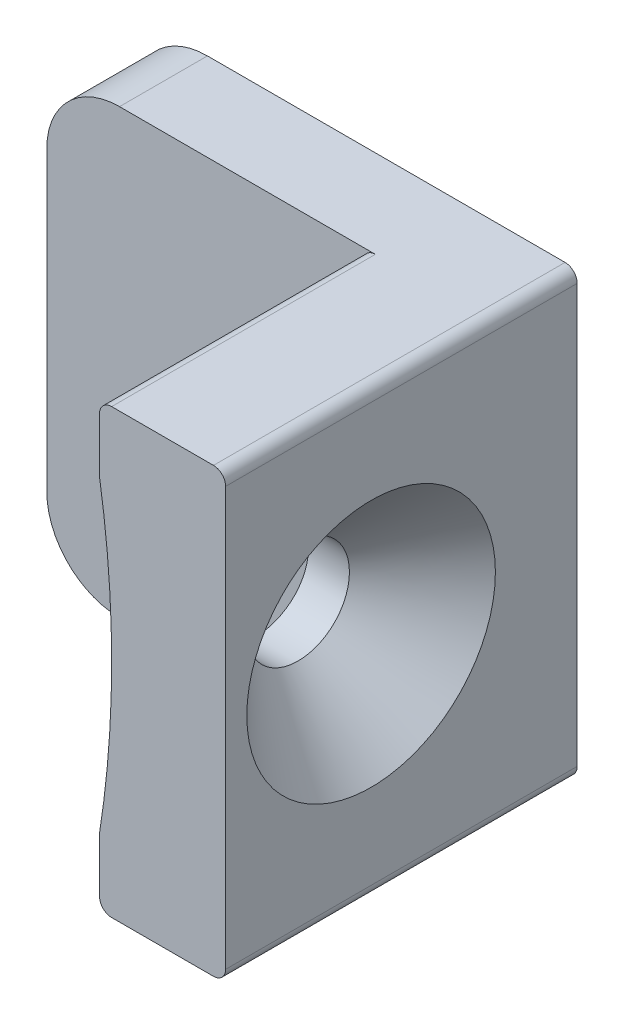
ISO-10303-21;
HEADER;
FILE_DESCRIPTION(('STEP AP214'),'2;1');
FILE_NAME('part.step','',(''),(''),'','','');
FILE_SCHEMA(('AUTOMOTIVE_DESIGN { 1 0 10303 214 1 1 1 1 }'));
ENDSEC;
DATA;
#1=APPLICATION_CONTEXT('core data for automotive mechanical design processes');
#2=APPLICATION_PROTOCOL_DEFINITION('international standard','automotive_design',2000,#1);
#3=PRODUCT_CONTEXT('',#1,'mechanical');
#4=PRODUCT('Part','Part','',(#3));
#5=PRODUCT_RELATED_PRODUCT_CATEGORY('part','',(#4));
#6=PRODUCT_DEFINITION_FORMATION('','',#4);
#7=PRODUCT_DEFINITION_CONTEXT('part definition',#1,'design');
#8=PRODUCT_DEFINITION('design','',#6,#7);
#9=PRODUCT_DEFINITION_SHAPE('','',#8);
#10=(LENGTH_UNIT() NAMED_UNIT(*) SI_UNIT(.MILLI.,.METRE.));
#11=(NAMED_UNIT(*) PLANE_ANGLE_UNIT() SI_UNIT($,.RADIAN.));
#12=(NAMED_UNIT(*) SI_UNIT($,.STERADIAN.) SOLID_ANGLE_UNIT());
#13=UNCERTAINTY_MEASURE_WITH_UNIT(LENGTH_MEASURE(1.E-05),#10,'distance_accuracy_value','');
#14=(GEOMETRIC_REPRESENTATION_CONTEXT(3) GLOBAL_UNCERTAINTY_ASSIGNED_CONTEXT((#13)) GLOBAL_UNIT_ASSIGNED_CONTEXT((#10,
#11,#12)) REPRESENTATION_CONTEXT('',''));
#15=CARTESIAN_POINT('',(0.,0.,0.));
#16=DIRECTION('',(0.,0.,1.));
#17=DIRECTION('',(1.,0.,0.));
#18=AXIS2_PLACEMENT_3D('',#15,#16,#17);
#19=CARTESIAN_POINT('',(0.,9.271,-8.636));
#20=DIRECTION('',(0.,0.,1.));
#21=DIRECTION('',(1.,0.,0.));
#22=AXIS2_PLACEMENT_3D('',#19,#20,#21);
#23=PLANE('',#22);
#24=DIRECTION('',(0.,-1.,0.));
#25=VECTOR('',#24,1.);
#26=CARTESIAN_POINT('',(0.,9.271,-8.636));
#27=LINE('',#26,#25);
#28=CARTESIAN_POINT('',(0.,8.763,-8.636));
#29=VERTEX_POINT('',#28);
#30=CARTESIAN_POINT('',(0.,-8.763,-8.636));
#31=VERTEX_POINT('',#30);
#32=EDGE_CURVE('E211',#29,#31,#27,.T.);
#33=ORIENTED_EDGE('',*,*,#32,.T.);
#34=CARTESIAN_POINT('',(-0.508,-8.763,-8.636));
#35=DIRECTION('',(0.,0.,1.));
#36=DIRECTION('',(1.,0.,0.));
#37=AXIS2_PLACEMENT_3D('',#34,#35,#36);
#38=CIRCLE('',#37,0.508);
#39=CARTESIAN_POINT('',(-0.508,-9.271,-8.636));
#40=VERTEX_POINT('',#39);
#41=EDGE_CURVE('E54',#31,#40,#38,.F.);
#42=ORIENTED_EDGE('',*,*,#41,.T.);
#43=DIRECTION('',(-1.,0.,0.));
#44=VECTOR('',#43,1.);
#45=CARTESIAN_POINT('',(0.,-9.271,-8.636));
#46=LINE('',#45,#44);
#47=CARTESIAN_POINT('',(-15.494,-9.271,-8.636));
#48=VERTEX_POINT('',#47);
#49=EDGE_CURVE('E346',#40,#48,#46,.T.);
#50=ORIENTED_EDGE('',*,*,#49,.T.);
#51=CARTESIAN_POINT('',(-15.494,-6.223,-8.636));
#52=DIRECTION('',(0.,0.,1.));
#53=DIRECTION('',(1.,0.,0.));
#54=AXIS2_PLACEMENT_3D('',#51,#52,#53);
#55=CIRCLE('',#54,3.048);
#56=CARTESIAN_POINT('',(-18.542,-6.223,-8.636));
#57=VERTEX_POINT('',#56);
#58=EDGE_CURVE('E314',#48,#57,#55,.F.);
#59=ORIENTED_EDGE('',*,*,#58,.T.);
#60=DIRECTION('',(0.,-1.,0.));
#61=VECTOR('',#60,1.);
#62=CARTESIAN_POINT('',(-18.542,9.271,-8.636));
#63=LINE('',#62,#61);
#64=CARTESIAN_POINT('',(-18.542,6.223,-8.636));
#65=VERTEX_POINT('',#64);
#66=EDGE_CURVE('E333',#65,#57,#63,.T.);
#67=ORIENTED_EDGE('',*,*,#66,.F.);
#68=CARTESIAN_POINT('',(-15.494,6.223,-8.636));
#69=DIRECTION('',(0.,0.,1.));
#70=DIRECTION('',(1.,0.,0.));
#71=AXIS2_PLACEMENT_3D('',#68,#69,#70);
#72=CIRCLE('',#71,3.048);
#73=CARTESIAN_POINT('',(-15.494,9.271,-8.636));
#74=VERTEX_POINT('',#73);
#75=EDGE_CURVE('E316',#65,#74,#72,.F.);
#76=ORIENTED_EDGE('',*,*,#75,.T.);
#77=DIRECTION('',(-1.,0.,0.));
#78=VECTOR('',#77,1.);
#79=CARTESIAN_POINT('',(0.,9.271,-8.636));
#80=LINE('',#79,#78);
#81=CARTESIAN_POINT('',(-0.508,9.271,-8.636));
#82=VERTEX_POINT('',#81);
#83=EDGE_CURVE('E343',#82,#74,#80,.T.);
#84=ORIENTED_EDGE('',*,*,#83,.F.);
#85=CARTESIAN_POINT('',(-0.508,8.763,-8.636));
#86=DIRECTION('',(0.,0.,1.));
#87=DIRECTION('',(1.,0.,0.));
#88=AXIS2_PLACEMENT_3D('',#85,#86,#87);
#89=CIRCLE('',#88,0.508);
#90=EDGE_CURVE('E62',#82,#29,#89,.F.);
#91=ORIENTED_EDGE('',*,*,#90,.T.);
#92=EDGE_LOOP('',(#33,#42,#50,#59,#67,#76,#84,#91));
#93=FACE_BOUND('',#92,.T.);
#94=CARTESIAN_POINT('',(-12.7,-3.175,-8.636));
#95=DIRECTION('',(0.,0.,-1.));
#96=DIRECTION('',(-1.,0.,0.));
#97=AXIS2_PLACEMENT_3D('',#94,#95,#96);
#98=CIRCLE('',#97,1.905);
#99=CARTESIAN_POINT('',(-14.605,-3.175,-8.636));
#100=VERTEX_POINT('',#99);
#101=EDGE_CURVE('E184',#100,#100,#98,.T.);
#102=ORIENTED_EDGE('',*,*,#101,.F.);
#103=EDGE_LOOP('',(#102));
#104=FACE_BOUND('',#103,.T.);
#105=ADVANCED_FACE('F39',(#93,#104),#23,.F.);
#106=CARTESIAN_POINT('',(0.,9.271,-8.636));
#107=DIRECTION('',(-1.,0.,0.));
#108=DIRECTION('',(0.,0.,1.));
#109=AXIS2_PLACEMENT_3D('',#106,#107,#108);
#110=PLANE('',#109);
#111=CARTESIAN_POINT('',(0.,0.,0.));
#112=DIRECTION('',(1.,0.,0.));
#113=DIRECTION('',(0.,0.,-1.));
#114=AXIS2_PLACEMENT_3D('',#111,#112,#113);
#115=CIRCLE('',#114,5.208);
#116=CARTESIAN_POINT('',(0.,0.,-5.208));
#117=VERTEX_POINT('',#116);
#118=EDGE_CURVE('E193',#117,#117,#115,.T.);
#119=ORIENTED_EDGE('',*,*,#118,.F.);
#120=EDGE_LOOP('',(#119));
#121=FACE_BOUND('',#120,.T.);
#122=DIRECTION('',(0.,-1.,0.));
#123=VECTOR('',#122,1.);
#124=CARTESIAN_POINT('',(0.,9.271,6.096));
#125=LINE('',#124,#123);
#126=CARTESIAN_POINT('',(0.,8.763,6.096));
#127=VERTEX_POINT('',#126);
#128=CARTESIAN_POINT('',(0.,-8.763,6.096));
#129=VERTEX_POINT('',#128);
#130=EDGE_CURVE('E335',#127,#129,#125,.T.);
#131=ORIENTED_EDGE('',*,*,#130,.T.);
#132=DIRECTION('',(0.,0.,-1.));
#133=VECTOR('',#132,1.);
#134=CARTESIAN_POINT('',(0.,-8.763,-8.636));
#135=LINE('',#134,#133);
#136=EDGE_CURVE('E270',#129,#31,#135,.T.);
#137=ORIENTED_EDGE('',*,*,#136,.T.);
#138=ORIENTED_EDGE('',*,*,#32,.F.);
#139=DIRECTION('',(0.,0.,-1.));
#140=VECTOR('',#139,1.);
#141=CARTESIAN_POINT('',(0.,8.763,-8.636));
#142=LINE('',#141,#140);
#143=EDGE_CURVE('E292',#29,#127,#142,.F.);
#144=ORIENTED_EDGE('',*,*,#143,.T.);
#145=EDGE_LOOP('',(#131,#137,#138,#144));
#146=FACE_BOUND('',#145,.T.);
#147=ADVANCED_FACE('F233',(#121,#146),#110,.F.);
#148=CARTESIAN_POINT('',(-18.542,9.271,-8.636));
#149=DIRECTION('',(1.,0.,0.));
#150=DIRECTION('',(0.,0.,-1.));
#151=AXIS2_PLACEMENT_3D('',#148,#149,#150);
#152=PLANE('',#151);
#153=ORIENTED_EDGE('',*,*,#66,.T.);
#154=DIRECTION('',(0.,0.,1.));
#155=VECTOR('',#154,1.);
#156=CARTESIAN_POINT('',(-18.542,-6.223,-4.953));
#157=LINE('',#156,#155);
#158=CARTESIAN_POINT('',(-18.542,-6.223,-4.953));
#159=VERTEX_POINT('',#158);
#160=EDGE_CURVE('E325',#57,#159,#157,.T.);
#161=ORIENTED_EDGE('',*,*,#160,.T.);
#162=DIRECTION('',(0.,-1.,0.));
#163=VECTOR('',#162,1.);
#164=CARTESIAN_POINT('',(-18.542,9.271,-4.953));
#165=LINE('',#164,#163);
#166=CARTESIAN_POINT('',(-18.542,6.223,-4.953));
#167=VERTEX_POINT('',#166);
#168=EDGE_CURVE('E334',#167,#159,#165,.T.);
#169=ORIENTED_EDGE('',*,*,#168,.F.);
#170=DIRECTION('',(0.,0.,1.));
#171=VECTOR('',#170,1.);
#172=CARTESIAN_POINT('',(-18.542,6.223,-8.636));
#173=LINE('',#172,#171);
#174=EDGE_CURVE('E212',#167,#65,#173,.F.);
#175=ORIENTED_EDGE('',*,*,#174,.T.);
#176=EDGE_LOOP('',(#153,#161,#169,#175));
#177=FACE_BOUND('',#176,.T.);
#178=ADVANCED_FACE('F238',(#177),#152,.F.);
#179=CARTESIAN_POINT('',(-18.542,9.271,-4.953));
#180=DIRECTION('',(0.,0.,-1.));
#181=DIRECTION('',(-1.,0.,0.));
#182=AXIS2_PLACEMENT_3D('',#179,#180,#181);
#183=PLANE('',#182);
#184=CARTESIAN_POINT('',(-12.7,-3.175,-4.953));
#185=DIRECTION('',(0.,0.,-1.));
#186=DIRECTION('',(-1.,0.,0.));
#187=AXIS2_PLACEMENT_3D('',#184,#185,#186);
#188=CIRCLE('',#187,1.905);
#189=CARTESIAN_POINT('',(-14.605,-3.175,-4.953));
#190=VERTEX_POINT('',#189);
#191=EDGE_CURVE('E180',#190,#190,#188,.T.);
#192=ORIENTED_EDGE('',*,*,#191,.T.);
#193=EDGE_LOOP('',(#192));
#194=FACE_BOUND('',#193,.T.);
#195=ORIENTED_EDGE('',*,*,#168,.T.);
#196=CARTESIAN_POINT('',(-15.494,-6.223,-4.953));
#197=DIRECTION('',(0.,0.,-1.));
#198=DIRECTION('',(-1.,0.,0.));
#199=AXIS2_PLACEMENT_3D('',#196,#197,#198);
#200=CIRCLE('',#199,3.048);
#201=CARTESIAN_POINT('',(-15.494,-9.271,-4.953));
#202=VERTEX_POINT('',#201);
#203=EDGE_CURVE('E322',#159,#202,#200,.F.);
#204=ORIENTED_EDGE('',*,*,#203,.T.);
#205=DIRECTION('',(1.,0.,0.));
#206=VECTOR('',#205,1.);
#207=CARTESIAN_POINT('',(-18.542,-9.271,-4.953));
#208=LINE('',#207,#206);
#209=CARTESIAN_POINT('',(-4.7752,-9.271,-4.953));
#210=VERTEX_POINT('',#209);
#211=EDGE_CURVE('E344',#202,#210,#208,.T.);
#212=ORIENTED_EDGE('',*,*,#211,.T.);
#213=CARTESIAN_POINT('',(-4.7752,-8.763,-4.953));
#214=DIRECTION('',(0.,0.,-1.));
#215=DIRECTION('',(-1.,0.,0.));
#216=AXIS2_PLACEMENT_3D('',#213,#214,#215);
#217=CIRCLE('',#216,0.508);
#218=CARTESIAN_POINT('',(-5.2832,-8.763,-4.953));
#219=VERTEX_POINT('',#218);
#220=EDGE_CURVE('E12',#210,#219,#217,.T.);
#221=ORIENTED_EDGE('',*,*,#220,.T.);
#222=DIRECTION('',(0.,-1.,0.));
#223=VECTOR('',#222,1.);
#224=CARTESIAN_POINT('',(-5.2832,-6.46179194960657,-4.953));
#225=LINE('',#224,#223);
#226=CARTESIAN_POINT('',(-5.2832,-6.46179194960657,-4.953));
#227=VERTEX_POINT('',#226);
#228=EDGE_CURVE('E151',#227,#219,#225,.T.);
#229=ORIENTED_EDGE('',*,*,#228,.F.);
#230=CARTESIAN_POINT('',(-46.1264,0.,-4.953));
#231=DIRECTION('',(0.,0.,-1.));
#232=DIRECTION('',(1.,0.,0.));
#233=AXIS2_PLACEMENT_3D('',#230,#231,#232);
#234=CIRCLE('',#233,41.3512);
#235=CARTESIAN_POINT('',(-5.2832,6.46179194960657,-4.953));
#236=VERTEX_POINT('',#235);
#237=EDGE_CURVE('E204',#236,#227,#234,.T.);
#238=ORIENTED_EDGE('',*,*,#237,.F.);
#239=DIRECTION('',(0.,-1.,0.));
#240=VECTOR('',#239,1.);
#241=CARTESIAN_POINT('',(-5.2832,6.46179194960657,-4.953));
#242=LINE('',#241,#240);
#243=CARTESIAN_POINT('',(-5.2832,8.763,-4.953));
#244=VERTEX_POINT('',#243);
#245=EDGE_CURVE('E157',#244,#236,#242,.T.);
#246=ORIENTED_EDGE('',*,*,#245,.F.);
#247=CARTESIAN_POINT('',(-4.7752,8.763,-4.953));
#248=DIRECTION('',(0.,0.,-1.));
#249=DIRECTION('',(-1.,0.,0.));
#250=AXIS2_PLACEMENT_3D('',#247,#248,#249);
#251=CIRCLE('',#250,0.508);
#252=CARTESIAN_POINT('',(-4.7752,9.271,-4.953));
#253=VERTEX_POINT('',#252);
#254=EDGE_CURVE('E47',#244,#253,#251,.T.);
#255=ORIENTED_EDGE('',*,*,#254,.T.);
#256=DIRECTION('',(1.,0.,0.));
#257=VECTOR('',#256,1.);
#258=CARTESIAN_POINT('',(-18.542,9.271,-4.953));
#259=LINE('',#258,#257);
#260=CARTESIAN_POINT('',(-15.494,9.271,-4.953));
#261=VERTEX_POINT('',#260);
#262=EDGE_CURVE('E303',#261,#253,#259,.T.);
#263=ORIENTED_EDGE('',*,*,#262,.F.);
#264=CARTESIAN_POINT('',(-15.494,6.223,-4.953));
#265=DIRECTION('',(0.,0.,-1.));
#266=DIRECTION('',(-1.,0.,0.));
#267=AXIS2_PLACEMENT_3D('',#264,#265,#266);
#268=CIRCLE('',#267,3.048);
#269=EDGE_CURVE('E324',#261,#167,#268,.F.);
#270=ORIENTED_EDGE('',*,*,#269,.T.);
#271=EDGE_LOOP('',(#195,#204,#212,#221,#229,#238,#246,#255,#263,#270));
#272=FACE_BOUND('',#271,.T.);
#273=ADVANCED_FACE('F302',(#194,#272),#183,.F.);
#274=CARTESIAN_POINT('',(0.,9.271,6.096));
#275=DIRECTION('',(0.,0.,-1.));
#276=DIRECTION('',(-1.,0.,0.));
#277=AXIS2_PLACEMENT_3D('',#274,#275,#276);
#278=PLANE('',#277);
#279=DIRECTION('',(1.,0.,0.));
#280=VECTOR('',#279,1.);
#281=CARTESIAN_POINT('',(0.,9.271,6.096));
#282=LINE('',#281,#280);
#283=CARTESIAN_POINT('',(-4.7752,9.271,6.096));
#284=VERTEX_POINT('',#283);
#285=CARTESIAN_POINT('',(-0.507999999999998,9.271,6.096));
#286=VERTEX_POINT('',#285);
#287=EDGE_CURVE('E340',#284,#286,#282,.T.);
#288=ORIENTED_EDGE('',*,*,#287,.F.);
#289=CARTESIAN_POINT('',(-4.7752,8.763,6.096));
#290=DIRECTION('',(0.,0.,-1.));
#291=DIRECTION('',(-1.,0.,0.));
#292=AXIS2_PLACEMENT_3D('',#289,#290,#291);
#293=CIRCLE('',#292,0.508);
#294=CARTESIAN_POINT('',(-5.2832,8.763,6.096));
#295=VERTEX_POINT('',#294);
#296=EDGE_CURVE('E148',#284,#295,#293,.F.);
#297=ORIENTED_EDGE('',*,*,#296,.T.);
#298=DIRECTION('',(0.,-1.,0.));
#299=VECTOR('',#298,1.);
#300=CARTESIAN_POINT('',(-5.2832,6.46179194960657,6.096));
#301=LINE('',#300,#299);
#302=CARTESIAN_POINT('',(-5.2832,6.46179194960657,6.096));
#303=VERTEX_POINT('',#302);
#304=EDGE_CURVE('E141',#295,#303,#301,.T.);
#305=ORIENTED_EDGE('',*,*,#304,.T.);
#306=CARTESIAN_POINT('',(-46.1264,0.,6.096));
#307=DIRECTION('',(0.,0.,-1.));
#308=DIRECTION('',(1.,0.,0.));
#309=AXIS2_PLACEMENT_3D('',#306,#307,#308);
#310=CIRCLE('',#309,41.3512);
#311=CARTESIAN_POINT('',(-5.2832,-6.46179194960657,6.096));
#312=VERTEX_POINT('',#311);
#313=EDGE_CURVE('E147',#303,#312,#310,.T.);
#314=ORIENTED_EDGE('',*,*,#313,.T.);
#315=DIRECTION('',(0.,-1.,0.));
#316=VECTOR('',#315,1.);
#317=CARTESIAN_POINT('',(-5.2832,-6.46179194960657,6.096));
#318=LINE('',#317,#316);
#319=CARTESIAN_POINT('',(-5.2832,-8.763,6.096));
#320=VERTEX_POINT('',#319);
#321=EDGE_CURVE('E162',#312,#320,#318,.T.);
#322=ORIENTED_EDGE('',*,*,#321,.T.);
#323=CARTESIAN_POINT('',(-4.7752,-8.763,6.096));
#324=DIRECTION('',(0.,0.,-1.));
#325=DIRECTION('',(-1.,0.,0.));
#326=AXIS2_PLACEMENT_3D('',#323,#324,#325);
#327=CIRCLE('',#326,0.508);
#328=CARTESIAN_POINT('',(-4.7752,-9.271,6.096));
#329=VERTEX_POINT('',#328);
#330=EDGE_CURVE('E274',#320,#329,#327,.F.);
#331=ORIENTED_EDGE('',*,*,#330,.T.);
#332=DIRECTION('',(1.,0.,0.));
#333=VECTOR('',#332,1.);
#334=CARTESIAN_POINT('',(0.,-9.271,6.096));
#335=LINE('',#334,#333);
#336=CARTESIAN_POINT('',(-0.507999999999998,-9.271,6.096));
#337=VERTEX_POINT('',#336);
#338=EDGE_CURVE('E341',#329,#337,#335,.T.);
#339=ORIENTED_EDGE('',*,*,#338,.T.);
#340=CARTESIAN_POINT('',(-0.507999999999998,-8.763,6.096));
#341=DIRECTION('',(0.,0.,-1.));
#342=DIRECTION('',(-1.,0.,0.));
#343=AXIS2_PLACEMENT_3D('',#340,#341,#342);
#344=CIRCLE('',#343,0.508);
#345=EDGE_CURVE('E268',#337,#129,#344,.F.);
#346=ORIENTED_EDGE('',*,*,#345,.T.);
#347=ORIENTED_EDGE('',*,*,#130,.F.);
#348=CARTESIAN_POINT('',(-0.507999999999998,8.763,6.096));
#349=DIRECTION('',(0.,0.,-1.));
#350=DIRECTION('',(-1.,0.,0.));
#351=AXIS2_PLACEMENT_3D('',#348,#349,#350);
#352=CIRCLE('',#351,0.508);
#353=EDGE_CURVE('E275',#127,#286,#352,.F.);
#354=ORIENTED_EDGE('',*,*,#353,.T.);
#355=EDGE_LOOP('',(#288,#297,#305,#314,#322,#331,#339,#346,#347,#354));
#356=FACE_BOUND('',#355,.T.);
#357=ADVANCED_FACE('F144',(#356),#278,.F.);
#358=CARTESIAN_POINT('',(0.,9.271,6.096));
#359=DIRECTION('',(0.,-1.,0.));
#360=DIRECTION('',(0.,0.,-1.));
#361=AXIS2_PLACEMENT_3D('',#358,#359,#360);
#362=PLANE('',#361);
#363=ORIENTED_EDGE('',*,*,#262,.T.);
#364=DIRECTION('',(0.,0.,1.));
#365=VECTOR('',#364,1.);
#366=CARTESIAN_POINT('',(-4.7752,9.271,6.096));
#367=LINE('',#366,#365);
#368=EDGE_CURVE('E278',#253,#284,#367,.T.);
#369=ORIENTED_EDGE('',*,*,#368,.T.);
#370=ORIENTED_EDGE('',*,*,#287,.T.);
#371=DIRECTION('',(0.,0.,-1.));
#372=VECTOR('',#371,1.);
#373=CARTESIAN_POINT('',(-0.507999999999998,9.271,6.096));
#374=LINE('',#373,#372);
#375=EDGE_CURVE('E307',#286,#82,#374,.T.);
#376=ORIENTED_EDGE('',*,*,#375,.T.);
#377=ORIENTED_EDGE('',*,*,#83,.T.);
#378=DIRECTION('',(0.,0.,1.));
#379=VECTOR('',#378,1.);
#380=CARTESIAN_POINT('',(-15.494,9.271,6.096));
#381=LINE('',#380,#379);
#382=EDGE_CURVE('E309',#74,#261,#381,.T.);
#383=ORIENTED_EDGE('',*,*,#382,.T.);
#384=EDGE_LOOP('',(#363,#369,#370,#376,#377,#383));
#385=FACE_BOUND('',#384,.T.);
#386=ADVANCED_FACE('F366',(#385),#362,.F.);
#387=CARTESIAN_POINT('',(0.,-9.271,6.096));
#388=DIRECTION('',(0.,-1.,0.));
#389=DIRECTION('',(0.,0.,-1.));
#390=AXIS2_PLACEMENT_3D('',#387,#388,#389);
#391=PLANE('',#390);
#392=ORIENTED_EDGE('',*,*,#338,.F.);
#393=DIRECTION('',(0.,0.,1.));
#394=VECTOR('',#393,1.);
#395=CARTESIAN_POINT('',(-4.7752,-9.271,-4.953));
#396=LINE('',#395,#394);
#397=EDGE_CURVE('E289',#329,#210,#396,.F.);
#398=ORIENTED_EDGE('',*,*,#397,.T.);
#399=ORIENTED_EDGE('',*,*,#211,.F.);
#400=DIRECTION('',(0.,0.,1.));
#401=VECTOR('',#400,1.);
#402=CARTESIAN_POINT('',(-15.494,-9.271,-8.636));
#403=LINE('',#402,#401);
#404=EDGE_CURVE('E319',#202,#48,#403,.F.);
#405=ORIENTED_EDGE('',*,*,#404,.T.);
#406=ORIENTED_EDGE('',*,*,#49,.F.);
#407=DIRECTION('',(0.,0.,-1.));
#408=VECTOR('',#407,1.);
#409=CARTESIAN_POINT('',(-0.507999999999998,-9.271,6.096));
#410=LINE('',#409,#408);
#411=EDGE_CURVE('E269',#40,#337,#410,.F.);
#412=ORIENTED_EDGE('',*,*,#411,.T.);
#413=EDGE_LOOP('',(#392,#398,#399,#405,#406,#412));
#414=FACE_BOUND('',#413,.T.);
#415=ADVANCED_FACE('F230',(#414),#391,.T.);
#416=CARTESIAN_POINT('',(-5.2832,6.46179194960657,6.096));
#417=DIRECTION('',(1.,0.,0.));
#418=DIRECTION('',(0.,0.,-1.));
#419=AXIS2_PLACEMENT_3D('',#416,#417,#418);
#420=PLANE('',#419);
#421=ORIENTED_EDGE('',*,*,#304,.F.);
#422=DIRECTION('',(0.,0.,1.));
#423=VECTOR('',#422,1.);
#424=CARTESIAN_POINT('',(-5.2832,8.763,6.096));
#425=LINE('',#424,#423);
#426=EDGE_CURVE('E283',#295,#244,#425,.F.);
#427=ORIENTED_EDGE('',*,*,#426,.T.);
#428=ORIENTED_EDGE('',*,*,#245,.T.);
#429=DIRECTION('',(0.,0.,-1.));
#430=VECTOR('',#429,1.);
#431=CARTESIAN_POINT('',(-5.2832,6.46179194960657,6.096));
#432=LINE('',#431,#430);
#433=EDGE_CURVE('E154',#303,#236,#432,.T.);
#434=ORIENTED_EDGE('',*,*,#433,.F.);
#435=EDGE_LOOP('',(#421,#427,#428,#434));
#436=FACE_BOUND('',#435,.T.);
#437=ADVANCED_FACE('F155',(#436),#420,.F.);
#438=CARTESIAN_POINT('',(-5.2832,-6.46179194960657,6.096));
#439=DIRECTION('',(1.,0.,0.));
#440=DIRECTION('',(0.,1.,0.));
#441=AXIS2_PLACEMENT_3D('',#438,#439,#440);
#442=PLANE('',#441);
#443=ORIENTED_EDGE('',*,*,#228,.T.);
#444=DIRECTION('',(0.,0.,1.));
#445=VECTOR('',#444,1.);
#446=CARTESIAN_POINT('',(-5.2832,-8.763,6.096));
#447=LINE('',#446,#445);
#448=EDGE_CURVE('E285',#219,#320,#447,.T.);
#449=ORIENTED_EDGE('',*,*,#448,.T.);
#450=ORIENTED_EDGE('',*,*,#321,.F.);
#451=DIRECTION('',(0.,0.,-1.));
#452=VECTOR('',#451,1.);
#453=CARTESIAN_POINT('',(-5.2832,-6.46179194960657,6.096));
#454=LINE('',#453,#452);
#455=EDGE_CURVE('E161',#312,#227,#454,.T.);
#456=ORIENTED_EDGE('',*,*,#455,.T.);
#457=EDGE_LOOP('',(#443,#449,#450,#456));
#458=FACE_BOUND('',#457,.T.);
#459=ADVANCED_FACE('F223',(#458),#442,.F.);
#460=CARTESIAN_POINT('',(-46.1264,0.,6.096));
#461=DIRECTION('',(0.,0.,-1.));
#462=DIRECTION('',(-1.,0.,0.));
#463=AXIS2_PLACEMENT_3D('',#460,#461,#462);
#464=CYLINDRICAL_SURFACE('',#463,41.3512);
#465=CARTESIAN_POINT('',(-4.7752,0.,-2.14999999999999));
#466=CARTESIAN_POINT('',(-4.77520074710571,0.120678964554851,-2.14999467632498));
#467=CARTESIAN_POINT('',(-4.77573393930883,0.241443354378444,-2.13980535198265));
#468=CARTESIAN_POINT('',(-4.77780968958223,0.479640221828589,-2.09930287179717));
#469=CARTESIAN_POINT('',(-4.77935343479779,0.597068610997243,-2.06896604710555));
#470=CARTESIAN_POINT('',(-4.78327557762407,0.825108525139665,-1.98903989224241));
#471=CARTESIAN_POINT('',(-4.78565354764943,0.935723508272641,-1.93946042358557));
#472=CARTESIAN_POINT('',(-4.79097637554328,1.14703120209292,-1.82247163535209));
#473=CARTESIAN_POINT('',(-4.79392110012527,1.24772623730271,-1.75506650653371));
#474=CARTESIAN_POINT('',(-4.80004976969199,1.43647431885869,-1.60425892959432));
#475=CARTESIAN_POINT('',(-4.80323393856039,1.52451530388225,-1.52084139363018));
#476=CARTESIAN_POINT('',(-4.8094806942943,1.68535327442053,-1.3404072341671));
#477=CARTESIAN_POINT('',(-4.81254327617282,1.75814963518787,-1.24339005360639));
#478=CARTESIAN_POINT('',(-4.81820311236307,1.88646595539575,-1.0384463123545));
#479=CARTESIAN_POINT('',(-4.82080010949678,1.94197637889247,-0.930513773444114));
#480=CARTESIAN_POINT('',(-4.82523315737425,2.03408394199787,-0.706845174570969));
#481=CARTESIAN_POINT('',(-4.82706921423992,2.07068123376708,-0.59110917739732));
#482=CARTESIAN_POINT('',(-4.82977128763771,2.12389148955062,-0.355230973402995));
#483=CARTESIAN_POINT('',(-4.83063818823228,2.14052266763943,-0.235092885668238));
#484=CARTESIAN_POINT('',(-4.83130684316296,2.15338479983349,0.00627273624174618));
#485=CARTESIAN_POINT('',(-4.83110860643318,2.14961592504953,0.127500261270519));
#486=CARTESIAN_POINT('',(-4.82967016316706,2.12180009844667,0.367479705599279));
#487=CARTESIAN_POINT('',(-4.82843096806731,2.09777283040511,0.486233913333098));
#488=CARTESIAN_POINT('',(-4.82505186761735,2.0301527708509,0.718021138762038));
#489=CARTESIAN_POINT('',(-4.82291195823038,1.98655989165047,0.831054130813688));
#490=CARTESIAN_POINT('',(-4.81797144525624,1.88102359131662,1.04825372205608));
#491=CARTESIAN_POINT('',(-4.81517051893766,1.81907120264347,1.15241595632176));
#492=CARTESIAN_POINT('',(-4.80922398536693,1.67858101174213,1.34886951063464));
#493=CARTESIAN_POINT('',(-4.8060783754736,1.60004308242065,1.44116073970682));
#494=CARTESIAN_POINT('',(-4.79979251327921,1.42850016621946,1.61136703432935));
#495=CARTESIAN_POINT('',(-4.79665227175372,1.33547813536624,1.68926492349561));
#496=CARTESIAN_POINT('',(-4.79073466637641,1.13766744820673,1.82834092742821));
#497=CARTESIAN_POINT('',(-4.78795730261865,1.03287878885048,1.88951903786068));
#498=CARTESIAN_POINT('',(-4.78307832382422,0.814499308529581,1.99341724352814));
#499=CARTESIAN_POINT('',(-4.78097673100211,0.700908198355037,2.03613673199033));
#500=CARTESIAN_POINT('',(-4.77768646177046,0.468152736497392,2.10189378150353));
#501=CARTESIAN_POINT('',(-4.7764977779735,0.348988429921862,2.12493150182308));
#502=CARTESIAN_POINT('',(-4.77516824034576,0.108618313854504,2.1506498724266));
#503=CARTESIAN_POINT('',(-4.77502616370716,-0.0125849473429394,2.15335427929833));
#504=CARTESIAN_POINT('',(-4.77580260491309,-0.25372352813293,2.13839126254012));
#505=CARTESIAN_POINT('',(-4.77672111895956,-0.373658852264515,2.12072391186317));
#506=CARTESIAN_POINT('',(-4.7795145074595,-0.608790414312651,2.06553855515299));
#507=CARTESIAN_POINT('',(-4.7813888589326,-0.72398920658486,2.02803140392302));
#508=CARTESIAN_POINT('',(-4.78588291857332,-0.94645634193916,1.93424214410709));
#509=CARTESIAN_POINT('',(-4.78850263138283,-1.05372463562721,1.87795991859514));
#510=CARTESIAN_POINT('',(-4.79419580539094,-1.25739486023042,1.74815738347496));
#511=CARTESIAN_POINT('',(-4.79726968457309,-1.35378663546197,1.67462115741362));
#512=CARTESIAN_POINT('',(-4.80352365309491,-1.53286548414003,1.51242128667143));
#513=CARTESIAN_POINT('',(-4.80670374316831,-1.61555246288853,1.42375753747035));
#514=CARTESIAN_POINT('',(-4.8128152021741,-1.76495459078919,1.2337172174545));
#515=CARTESIAN_POINT('',(-4.81574632991669,-1.83165436327126,1.1323285493077));
#516=CARTESIAN_POINT('',(-4.82102553328299,-1.9470836107492,0.919777520976472));
#517=CARTESIAN_POINT('',(-4.82337361159819,-1.99581316870048,0.808615205912801));
#518=CARTESIAN_POINT('',(-4.82722020718699,-2.07389194904525,0.579729224847388));
#519=CARTESIAN_POINT('',(-4.82871915332447,-2.10325095599253,0.462008904098823));
#520=CARTESIAN_POINT('',(-4.83069965580835,-2.14178723509145,0.223301796416803));
#521=CARTESIAN_POINT('',(-4.8311812185539,-2.15096463418156,0.102315030033515));
#522=CARTESIAN_POINT('',(-4.83107249187765,-2.14887598517946,-0.139337566361198));
#523=CARTESIAN_POINT('',(-4.83048347059663,-2.13763412435944,-0.260003606746987));
#524=CARTESIAN_POINT('',(-4.82830264211855,-2.09507609094876,-0.497732648968432));
#525=CARTESIAN_POINT('',(-4.82671083302242,-2.06375988034152,-0.614795643980239));
#526=CARTESIAN_POINT('',(-4.82270412399843,-1.98194712847672,-0.842000429189163));
#527=CARTESIAN_POINT('',(-4.82028921945833,-1.93145047974096,-0.952142180598838));
#528=CARTESIAN_POINT('',(-4.81490856332741,-1.81271426868203,-1.16238621521004));
#529=CARTESIAN_POINT('',(-4.81194282825681,-1.74447523845426,-1.26248879936222));
#530=CARTESIAN_POINT('',(-4.80579074126657,-1.59210411206258,-1.44993414996083));
#531=CARTESIAN_POINT('',(-4.80260415581735,-1.50795502487115,-1.5372630964136));
#532=CARTESIAN_POINT('',(-4.79637123138517,-1.32616611377022,-1.69658250460937));
#533=CARTESIAN_POINT('',(-4.79332492706917,-1.22852297874452,-1.76856919067397));
#534=CARTESIAN_POINT('',(-4.78771357634104,-1.02243610740425,-1.89519707093));
#535=CARTESIAN_POINT('',(-4.785149013322,-0.913981687958728,-1.94982088033957));
#536=CARTESIAN_POINT('',(-4.78079722651707,-0.689508608859906,-2.04001858080754));
#537=CARTESIAN_POINT('',(-4.77900908616502,-0.57349905519173,-2.07561494528337));
#538=CARTESIAN_POINT('',(-4.77688395949003,-0.380641922971109,-2.11742260601107));
#539=CARTESIAN_POINT('',(-4.77625525441387,-0.305043155569994,-2.12962350313255));
#540=CARTESIAN_POINT('',(-4.77541303804782,-0.152974368811247,-2.14591388383527));
#541=CARTESIAN_POINT('',(-4.77519952637283,-0.0765043502618153,-2.15000337494027));
#542=CARTESIAN_POINT('',(-4.7752,0.,-2.14999999999999));
#543=B_SPLINE_CURVE_WITH_KNOTS('',3,(#465,#466,#467,#468,#469,#470,#471,#472,#473,#474,#475,
#476,#477,#478,#479,#480,#481,#482,#483,#484,#485,#486,#487,#488,#489,#490,#491,#492,#493,#494,
#495,#496,#497,#498,#499,#500,#501,#502,#503,#504,#505,#506,#507,#508,#509,#510,#511,#512,#513,
#514,#515,#516,#517,#518,#519,#520,#521,#522,#523,#524,#525,#526,#527,#528,#529,#530,#531,#532,
#533,#534,#535,#536,#537,#538,#539,#540,#541,#542),.UNSPECIFIED.,.T.,.F.,(4,2,2,2,2,2,2,2,2,2,2,
2,2,2,2,2,2,2,2,2,2,2,2,2,2,2,2,2,2,2,2,2,2,2,2,2,2,2,4),(0.,0.361757621824666,
0.723940982233918,1.08593897464567,1.44785193797544,1.81010760622842,2.17237811735349,
2.53484812568568,2.89731521781691,3.2594513977005,3.6215845400767,3.98336622592258,
4.34514953319243,4.70710984238694,5.06907292534681,5.43146520817604,5.79385758493947,
6.15626187337834,6.51866322914663,6.88064110452728,7.24261768363869,7.60439642171744,
7.96617741289644,8.32829346073779,8.69041201064042,9.05287746495524,9.41534124600985,
9.77762179700973,10.1399000693273,10.5017494911646,10.8635995982704,11.2254517330449,
11.5872930170972,11.9495229321727,12.3118418881338,12.6745224856875,13.0367737673876,
13.2661099866956,13.4954459932817),.UNSPECIFIED.);
#544=CARTESIAN_POINT('',(-4.7752,0.,-2.14999999999999));
#545=VERTEX_POINT('',#544);
#546=EDGE_CURVE('E197',#545,#545,#543,.T.);
#547=ORIENTED_EDGE('',*,*,#546,.T.);
#548=EDGE_LOOP('',(#547));
#549=FACE_BOUND('',#548,.T.);
#550=ORIENTED_EDGE('',*,*,#237,.T.);
#551=ORIENTED_EDGE('',*,*,#455,.F.);
#552=ORIENTED_EDGE('',*,*,#313,.F.);
#553=ORIENTED_EDGE('',*,*,#433,.T.);
#554=EDGE_LOOP('',(#550,#551,#552,#553));
#555=FACE_BOUND('',#554,.T.);
#556=ADVANCED_FACE('F164',(#549,#555),#464,.F.);
#557=CARTESIAN_POINT('',(0.,0.,0.));
#558=DIRECTION('',(1.,0.,0.));
#559=DIRECTION('',(0.,0.,-1.));
#560=AXIS2_PLACEMENT_3D('',#557,#558,#559);
#561=CYLINDRICAL_SURFACE('',#560,2.14999999999999);
#562=CARTESIAN_POINT('',(-3.058,0.,0.));
#563=DIRECTION('',(1.,0.,0.));
#564=DIRECTION('',(0.,0.,-1.));
#565=AXIS2_PLACEMENT_3D('',#562,#563,#564);
#566=CIRCLE('',#565,2.14999999999999);
#567=CARTESIAN_POINT('',(-3.058,0.,-2.14999999999999));
#568=VERTEX_POINT('',#567);
#569=EDGE_CURVE('E195',#568,#568,#566,.T.);
#570=ORIENTED_EDGE('',*,*,#569,.T.);
#571=EDGE_LOOP('',(#570));
#572=FACE_BOUND('',#571,.T.);
#573=ORIENTED_EDGE('',*,*,#546,.F.);
#574=EDGE_LOOP('',(#573));
#575=FACE_BOUND('',#574,.T.);
#576=ADVANCED_FACE('F217',(#572,#575),#561,.F.);
#577=CARTESIAN_POINT('',(0.,0.,0.));
#578=DIRECTION('',(1.,0.,0.));
#579=DIRECTION('',(0.,0.,-1.));
#580=AXIS2_PLACEMENT_3D('',#577,#578,#579);
#581=CONICAL_SURFACE('',#580,5.208,0.785398163397449);
#582=ORIENTED_EDGE('',*,*,#569,.F.);
#583=EDGE_LOOP('',(#582));
#584=FACE_BOUND('',#583,.T.);
#585=ORIENTED_EDGE('',*,*,#118,.T.);
#586=EDGE_LOOP('',(#585));
#587=FACE_BOUND('',#586,.T.);
#588=ADVANCED_FACE('F221',(#584,#587),#581,.F.);
#589=CARTESIAN_POINT('',(-12.7,-3.175,-5.50545));
#590=DIRECTION('',(0.,0.,1.));
#591=DIRECTION('',(1.,0.,0.));
#592=AXIS2_PLACEMENT_3D('',#589,#590,#591);
#593=CONICAL_SURFACE('',#592,1.35255,0.785398163397447);
#594=ORIENTED_EDGE('',*,*,#191,.F.);
#595=EDGE_LOOP('',(#594));
#596=FACE_BOUND('',#595,.T.);
#597=CARTESIAN_POINT('',(-12.7,-3.175,-5.50545));
#598=DIRECTION('',(0.,0.,-1.));
#599=DIRECTION('',(-1.,0.,0.));
#600=AXIS2_PLACEMENT_3D('',#597,#598,#599);
#601=CIRCLE('',#600,1.35255);
#602=CARTESIAN_POINT('',(-14.05255,-3.175,-5.50545));
#603=VERTEX_POINT('',#602);
#604=EDGE_CURVE('E190',#603,#603,#601,.T.);
#605=ORIENTED_EDGE('',*,*,#604,.T.);
#606=EDGE_LOOP('',(#605));
#607=FACE_BOUND('',#606,.T.);
#608=ADVANCED_FACE('F386',(#596,#607),#593,.F.);
#609=CARTESIAN_POINT('',(-12.7,-3.175,-8.636));
#610=DIRECTION('',(0.,0.,-1.));
#611=DIRECTION('',(-1.,0.,0.));
#612=AXIS2_PLACEMENT_3D('',#609,#610,#611);
#613=CYLINDRICAL_SURFACE('',#612,1.35255);
#614=ORIENTED_EDGE('',*,*,#604,.F.);
#615=EDGE_LOOP('',(#614));
#616=FACE_BOUND('',#615,.T.);
#617=CARTESIAN_POINT('',(-12.7,-3.175,-8.08355));
#618=DIRECTION('',(0.,0.,-1.));
#619=DIRECTION('',(-1.,0.,0.));
#620=AXIS2_PLACEMENT_3D('',#617,#618,#619);
#621=CIRCLE('',#620,1.35255);
#622=CARTESIAN_POINT('',(-14.05255,-3.175,-8.08355));
#623=VERTEX_POINT('',#622);
#624=EDGE_CURVE('E187',#623,#623,#621,.T.);
#625=ORIENTED_EDGE('',*,*,#624,.T.);
#626=EDGE_LOOP('',(#625));
#627=FACE_BOUND('',#626,.T.);
#628=ADVANCED_FACE('F389',(#616,#627),#613,.F.);
#629=CARTESIAN_POINT('',(-12.7,-3.175,-8.636));
#630=DIRECTION('',(0.,0.,-1.));
#631=DIRECTION('',(-1.,0.,0.));
#632=AXIS2_PLACEMENT_3D('',#629,#630,#631);
#633=CONICAL_SURFACE('',#632,1.905,0.785398163397448);
#634=ORIENTED_EDGE('',*,*,#624,.F.);
#635=EDGE_LOOP('',(#634));
#636=FACE_BOUND('',#635,.T.);
#637=ORIENTED_EDGE('',*,*,#101,.T.);
#638=EDGE_LOOP('',(#637));
#639=FACE_BOUND('',#638,.T.);
#640=ADVANCED_FACE('F249',(#636,#639),#633,.F.);
#641=CARTESIAN_POINT('',(-15.494,-6.223,-8.636));
#642=DIRECTION('',(0.,0.,-1.));
#643=DIRECTION('',(-1.,0.,0.));
#644=AXIS2_PLACEMENT_3D('',#641,#642,#643);
#645=CYLINDRICAL_SURFACE('',#644,3.048);
#646=ORIENTED_EDGE('',*,*,#58,.F.);
#647=ORIENTED_EDGE('',*,*,#404,.F.);
#648=ORIENTED_EDGE('',*,*,#203,.F.);
#649=ORIENTED_EDGE('',*,*,#160,.F.);
#650=EDGE_LOOP('',(#646,#647,#648,#649));
#651=FACE_BOUND('',#650,.T.);
#652=ADVANCED_FACE('F245',(#651),#645,.T.);
#653=CARTESIAN_POINT('',(-15.494,6.223,6.096));
#654=DIRECTION('',(0.,0.,1.));
#655=DIRECTION('',(1.,0.,0.));
#656=AXIS2_PLACEMENT_3D('',#653,#654,#655);
#657=CYLINDRICAL_SURFACE('',#656,3.048);
#658=ORIENTED_EDGE('',*,*,#75,.F.);
#659=ORIENTED_EDGE('',*,*,#174,.F.);
#660=ORIENTED_EDGE('',*,*,#269,.F.);
#661=ORIENTED_EDGE('',*,*,#382,.F.);
#662=EDGE_LOOP('',(#658,#659,#660,#661));
#663=FACE_BOUND('',#662,.T.);
#664=ADVANCED_FACE('F248',(#663),#657,.T.);
#665=CARTESIAN_POINT('',(-4.7752,8.763,6.096));
#666=DIRECTION('',(0.,0.,1.));
#667=DIRECTION('',(1.,0.,0.));
#668=AXIS2_PLACEMENT_3D('',#665,#666,#667);
#669=CYLINDRICAL_SURFACE('',#668,0.508);
#670=ORIENTED_EDGE('',*,*,#254,.F.);
#671=ORIENTED_EDGE('',*,*,#426,.F.);
#672=ORIENTED_EDGE('',*,*,#296,.F.);
#673=ORIENTED_EDGE('',*,*,#368,.F.);
#674=EDGE_LOOP('',(#670,#671,#672,#673));
#675=FACE_BOUND('',#674,.T.);
#676=ADVANCED_FACE('F253',(#675),#669,.T.);
#677=CARTESIAN_POINT('',(-4.7752,-8.763,6.096));
#678=DIRECTION('',(0.,0.,-1.));
#679=DIRECTION('',(-1.,0.,0.));
#680=AXIS2_PLACEMENT_3D('',#677,#678,#679);
#681=CYLINDRICAL_SURFACE('',#680,0.508);
#682=ORIENTED_EDGE('',*,*,#220,.F.);
#683=ORIENTED_EDGE('',*,*,#397,.F.);
#684=ORIENTED_EDGE('',*,*,#330,.F.);
#685=ORIENTED_EDGE('',*,*,#448,.F.);
#686=EDGE_LOOP('',(#682,#683,#684,#685));
#687=FACE_BOUND('',#686,.T.);
#688=ADVANCED_FACE('F257',(#687),#681,.T.);
#689=CARTESIAN_POINT('',(-0.508,-8.763,-8.636));
#690=DIRECTION('',(0.,0.,1.));
#691=DIRECTION('',(1.,0.,0.));
#692=AXIS2_PLACEMENT_3D('',#689,#690,#691);
#693=CYLINDRICAL_SURFACE('',#692,0.508);
#694=ORIENTED_EDGE('',*,*,#345,.F.);
#695=ORIENTED_EDGE('',*,*,#411,.F.);
#696=ORIENTED_EDGE('',*,*,#41,.F.);
#697=ORIENTED_EDGE('',*,*,#136,.F.);
#698=EDGE_LOOP('',(#694,#695,#696,#697));
#699=FACE_BOUND('',#698,.T.);
#700=ADVANCED_FACE('F260',(#699),#693,.T.);
#701=CARTESIAN_POINT('',(-0.507999999999998,8.763,6.096));
#702=DIRECTION('',(0.,0.,-1.));
#703=DIRECTION('',(-1.,0.,0.));
#704=AXIS2_PLACEMENT_3D('',#701,#702,#703);
#705=CYLINDRICAL_SURFACE('',#704,0.508);
#706=ORIENTED_EDGE('',*,*,#353,.F.);
#707=ORIENTED_EDGE('',*,*,#143,.F.);
#708=ORIENTED_EDGE('',*,*,#90,.F.);
#709=ORIENTED_EDGE('',*,*,#375,.F.);
#710=EDGE_LOOP('',(#706,#707,#708,#709));
#711=FACE_BOUND('',#710,.T.);
#712=ADVANCED_FACE('F41',(#711),#705,.T.);
#713=CLOSED_SHELL('',(#105,#147,#178,#273,#357,#386,#415,#437,#459,#556,#576,#588,#608,#628,
#640,#652,#664,#676,#688,#700,#712));
#714=MANIFOLD_SOLID_BREP('B2',#713);
#715=ADVANCED_BREP_SHAPE_REPRESENTATION('',(#18,#714),#14);
#716=SHAPE_DEFINITION_REPRESENTATION(#9,#715);
ENDSEC;
END-ISO-10303-21;
